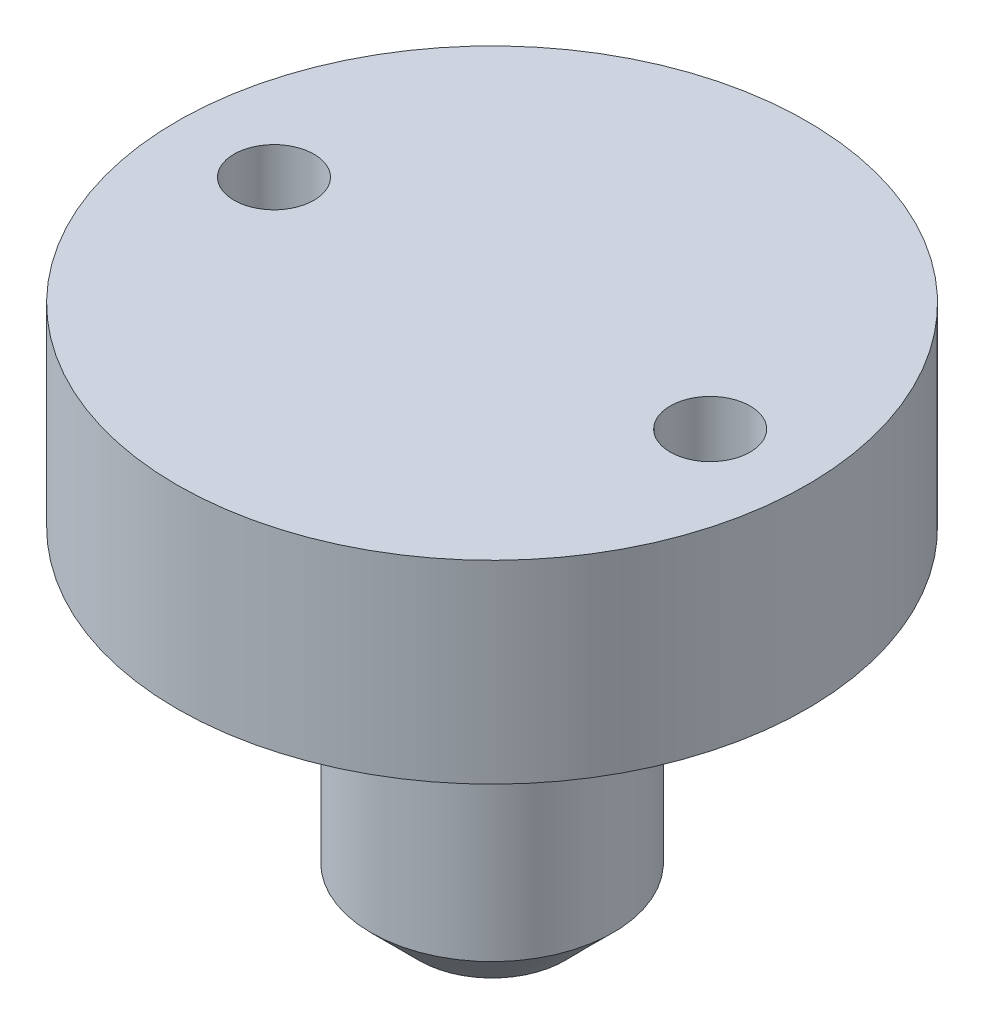
ISO-10303-21;
HEADER;
FILE_DESCRIPTION(('STEP AP214'),'2;1');
FILE_NAME('part.step','',(''),(''),'','','');
FILE_SCHEMA(('AUTOMOTIVE_DESIGN { 1 0 10303 214 1 1 1 1 }'));
ENDSEC;
DATA;
#1=APPLICATION_CONTEXT('core data for automotive mechanical design processes');
#2=APPLICATION_PROTOCOL_DEFINITION('international standard','automotive_design',2000,#1);
#3=PRODUCT_CONTEXT('',#1,'mechanical');
#4=PRODUCT('Part','Part','',(#3));
#5=PRODUCT_RELATED_PRODUCT_CATEGORY('part','',(#4));
#6=PRODUCT_DEFINITION_FORMATION('','',#4);
#7=PRODUCT_DEFINITION_CONTEXT('part definition',#1,'design');
#8=PRODUCT_DEFINITION('design','',#6,#7);
#9=PRODUCT_DEFINITION_SHAPE('','',#8);
#10=(LENGTH_UNIT() NAMED_UNIT(*) SI_UNIT(.MILLI.,.METRE.));
#11=(NAMED_UNIT(*) PLANE_ANGLE_UNIT() SI_UNIT($,.RADIAN.));
#12=(NAMED_UNIT(*) SI_UNIT($,.STERADIAN.) SOLID_ANGLE_UNIT());
#13=UNCERTAINTY_MEASURE_WITH_UNIT(LENGTH_MEASURE(1.E-05),#10,'distance_accuracy_value','');
#14=(GEOMETRIC_REPRESENTATION_CONTEXT(3) GLOBAL_UNCERTAINTY_ASSIGNED_CONTEXT((#13)) GLOBAL_UNIT_ASSIGNED_CONTEXT((#10,
#11,#12)) REPRESENTATION_CONTEXT('',''));
#15=CARTESIAN_POINT('',(0.,0.,0.));
#16=DIRECTION('',(0.,0.,1.));
#17=DIRECTION('',(1.,0.,0.));
#18=AXIS2_PLACEMENT_3D('',#15,#16,#17);
#19=CARTESIAN_POINT('',(0.,0.,0.));
#20=DIRECTION('',(0.,1.,0.));
#21=DIRECTION('',(0.,0.,1.));
#22=AXIS2_PLACEMENT_3D('',#19,#20,#21);
#23=PLANE('',#22);
#24=CARTESIAN_POINT('',(0.,0.,0.));
#25=DIRECTION('',(0.,1.,0.));
#26=DIRECTION('',(0.,0.,1.));
#27=AXIS2_PLACEMENT_3D('',#24,#25,#26);
#28=CIRCLE('',#27,3.00000000000001);
#29=CARTESIAN_POINT('',(0.,0.,3.00000000000001));
#30=VERTEX_POINT('',#29);
#31=EDGE_CURVE('E11',#30,#30,#28,.F.);
#32=ORIENTED_EDGE('',*,*,#31,.T.);
#33=EDGE_LOOP('',(#32));
#34=FACE_BOUND('',#33,.T.);
#35=ADVANCED_FACE('F41',(#34),#23,.F.);
#36=CARTESIAN_POINT('',(0.,60.7909556313993,0.));
#37=DIRECTION('',(0.,1.,0.));
#38=DIRECTION('',(0.,0.,1.));
#39=AXIS2_PLACEMENT_3D('',#36,#37,#38);
#40=CYLINDRICAL_SURFACE('',#39,5.00000000000001);
#41=CARTESIAN_POINT('',(0.,1.99999999999999,0.));
#42=DIRECTION('',(0.,1.,0.));
#43=DIRECTION('',(0.,0.,1.));
#44=AXIS2_PLACEMENT_3D('',#41,#42,#43);
#45=CIRCLE('',#44,5.00000000000001);
#46=CARTESIAN_POINT('',(0.,1.99999999999999,5.00000000000001));
#47=VERTEX_POINT('',#46);
#48=EDGE_CURVE('E49',#47,#47,#45,.T.);
#49=ORIENTED_EDGE('',*,*,#48,.T.);
#50=EDGE_LOOP('',(#49));
#51=FACE_BOUND('',#50,.T.);
#52=CARTESIAN_POINT('',(0.,12.,0.));
#53=DIRECTION('',(0.,1.,0.));
#54=DIRECTION('',(0.,0.,1.));
#55=AXIS2_PLACEMENT_3D('',#52,#53,#54);
#56=CIRCLE('',#55,5.00000000000001);
#57=CARTESIAN_POINT('',(0.,12.,5.00000000000001));
#58=VERTEX_POINT('',#57);
#59=EDGE_CURVE('E88',#58,#58,#56,.T.);
#60=ORIENTED_EDGE('',*,*,#59,.F.);
#61=EDGE_LOOP('',(#60));
#62=FACE_BOUND('',#61,.T.);
#63=ADVANCED_FACE('F93',(#51,#62),#40,.T.);
#64=CARTESIAN_POINT('',(5.00000000000001,12.,0.));
#65=DIRECTION('',(0.,-1.,0.));
#66=DIRECTION('',(0.,0.,-1.));
#67=AXIS2_PLACEMENT_3D('',#64,#65,#66);
#68=PLANE('',#67);
#69=CARTESIAN_POINT('',(0.,12.,0.));
#70=DIRECTION('',(0.,1.,0.));
#71=DIRECTION('',(0.,0.,1.));
#72=AXIS2_PLACEMENT_3D('',#69,#70,#71);
#73=CIRCLE('',#72,4.00000000000001);
#74=CARTESIAN_POINT('',(0.,12.,4.00000000000001));
#75=VERTEX_POINT('',#74);
#76=EDGE_CURVE('E85',#75,#75,#73,.T.);
#77=ORIENTED_EDGE('',*,*,#76,.F.);
#78=EDGE_LOOP('',(#77));
#79=FACE_BOUND('',#78,.T.);
#80=ORIENTED_EDGE('',*,*,#59,.T.);
#81=EDGE_LOOP('',(#80));
#82=FACE_BOUND('',#81,.T.);
#83=ADVANCED_FACE('F114',(#79,#82),#68,.F.);
#84=CARTESIAN_POINT('',(0.,60.7909556313993,0.));
#85=DIRECTION('',(0.,1.,0.));
#86=DIRECTION('',(0.,0.,1.));
#87=AXIS2_PLACEMENT_3D('',#84,#85,#86);
#88=CYLINDRICAL_SURFACE('',#87,4.00000000000001);
#89=CARTESIAN_POINT('',(0.,14.,0.));
#90=DIRECTION('',(0.,1.,0.));
#91=DIRECTION('',(0.,0.,1.));
#92=AXIS2_PLACEMENT_3D('',#89,#90,#91);
#93=CIRCLE('',#92,4.00000000000001);
#94=CARTESIAN_POINT('',(0.,14.,4.00000000000001));
#95=VERTEX_POINT('',#94);
#96=EDGE_CURVE('E82',#95,#95,#93,.T.);
#97=ORIENTED_EDGE('',*,*,#96,.F.);
#98=EDGE_LOOP('',(#97));
#99=FACE_BOUND('',#98,.T.);
#100=ORIENTED_EDGE('',*,*,#76,.T.);
#101=EDGE_LOOP('',(#100));
#102=FACE_BOUND('',#101,.T.);
#103=ADVANCED_FACE('F119',(#99,#102),#88,.T.);
#104=CARTESIAN_POINT('',(4.00000000000001,14.,0.));
#105=DIRECTION('',(0.,1.,0.));
#106=DIRECTION('',(0.,0.,1.));
#107=AXIS2_PLACEMENT_3D('',#104,#105,#106);
#108=PLANE('',#107);
#109=CARTESIAN_POINT('',(0.,14.,0.));
#110=DIRECTION('',(0.,1.,0.));
#111=DIRECTION('',(0.,0.,1.));
#112=AXIS2_PLACEMENT_3D('',#109,#110,#111);
#113=CIRCLE('',#112,13.);
#114=CARTESIAN_POINT('',(0.,14.,13.));
#115=VERTEX_POINT('',#114);
#116=EDGE_CURVE('E79',#115,#115,#113,.T.);
#117=ORIENTED_EDGE('',*,*,#116,.F.);
#118=EDGE_LOOP('',(#117));
#119=FACE_BOUND('',#118,.T.);
#120=ORIENTED_EDGE('',*,*,#96,.T.);
#121=EDGE_LOOP('',(#120));
#122=FACE_BOUND('',#121,.T.);
#123=ADVANCED_FACE('F123',(#119,#122),#108,.F.);
#124=CARTESIAN_POINT('',(0.,60.7909556313993,0.));
#125=DIRECTION('',(0.,1.,0.));
#126=DIRECTION('',(0.,0.,1.));
#127=AXIS2_PLACEMENT_3D('',#124,#125,#126);
#128=CYLINDRICAL_SURFACE('',#127,13.);
#129=CARTESIAN_POINT('',(0.,22.,0.));
#130=DIRECTION('',(0.,1.,0.));
#131=DIRECTION('',(0.,0.,1.));
#132=AXIS2_PLACEMENT_3D('',#129,#130,#131);
#133=CIRCLE('',#132,13.);
#134=CARTESIAN_POINT('',(0.,22.,13.));
#135=VERTEX_POINT('',#134);
#136=EDGE_CURVE('E76',#135,#135,#133,.T.);
#137=ORIENTED_EDGE('',*,*,#136,.F.);
#138=EDGE_LOOP('',(#137));
#139=FACE_BOUND('',#138,.T.);
#140=ORIENTED_EDGE('',*,*,#116,.T.);
#141=EDGE_LOOP('',(#140));
#142=FACE_BOUND('',#141,.T.);
#143=ADVANCED_FACE('F105',(#139,#142),#128,.T.);
#144=CARTESIAN_POINT('',(13.,22.,0.));
#145=DIRECTION('',(0.,-1.,0.));
#146=DIRECTION('',(0.,0.,-1.));
#147=AXIS2_PLACEMENT_3D('',#144,#145,#146);
#148=PLANE('',#147);
#149=CARTESIAN_POINT('',(-9.,22.,0.));
#150=DIRECTION('',(0.,1.,0.));
#151=DIRECTION('',(0.,0.,1.));
#152=AXIS2_PLACEMENT_3D('',#149,#150,#151);
#153=CIRCLE('',#152,1.65);
#154=CARTESIAN_POINT('',(-9.,22.,1.65));
#155=VERTEX_POINT('',#154);
#156=EDGE_CURVE('E66',#155,#155,#153,.T.);
#157=ORIENTED_EDGE('',*,*,#156,.F.);
#158=EDGE_LOOP('',(#157));
#159=FACE_BOUND('',#158,.T.);
#160=CARTESIAN_POINT('',(9.,22.,0.));
#161=DIRECTION('',(0.,1.,0.));
#162=DIRECTION('',(0.,0.,1.));
#163=AXIS2_PLACEMENT_3D('',#160,#161,#162);
#164=CIRCLE('',#163,1.65);
#165=CARTESIAN_POINT('',(9.,22.,1.65));
#166=VERTEX_POINT('',#165);
#167=EDGE_CURVE('E65',#166,#166,#164,.T.);
#168=ORIENTED_EDGE('',*,*,#167,.F.);
#169=EDGE_LOOP('',(#168));
#170=FACE_BOUND('',#169,.T.);
#171=ORIENTED_EDGE('',*,*,#136,.T.);
#172=EDGE_LOOP('',(#171));
#173=FACE_BOUND('',#172,.T.);
#174=ADVANCED_FACE('F98',(#159,#170,#173),#148,.F.);
#175=CARTESIAN_POINT('',(0.,1.99999999999999,0.));
#176=DIRECTION('',(0.,1.,0.));
#177=DIRECTION('',(0.,0.,1.));
#178=AXIS2_PLACEMENT_3D('',#175,#176,#177);
#179=CONICAL_SURFACE('',#178,5.00000000000001,0.78539816339745);
#180=ORIENTED_EDGE('',*,*,#31,.F.);
#181=EDGE_LOOP('',(#180));
#182=FACE_BOUND('',#181,.T.);
#183=ORIENTED_EDGE('',*,*,#48,.F.);
#184=EDGE_LOOP('',(#183));
#185=FACE_BOUND('',#184,.T.);
#186=ADVANCED_FACE('F43',(#182,#185),#179,.T.);
#187=CARTESIAN_POINT('',(9.,18.,0.));
#188=DIRECTION('',(0.,1.,0.));
#189=DIRECTION('',(0.,0.,1.));
#190=AXIS2_PLACEMENT_3D('',#187,#188,#189);
#191=CONICAL_SURFACE('',#190,1.65,1.02974425867665);
#192=CARTESIAN_POINT('',(9.,17.0085799786045,0.));
#193=VERTEX_POINT('',#192);
#194=VERTEX_LOOP('',#193);
#195=FACE_BOUND('',#194,.T.);
#196=CARTESIAN_POINT('',(9.,18.,0.));
#197=DIRECTION('',(0.,1.,0.));
#198=DIRECTION('',(0.,0.,1.));
#199=AXIS2_PLACEMENT_3D('',#196,#197,#198);
#200=CIRCLE('',#199,1.65);
#201=CARTESIAN_POINT('',(9.,18.,1.65));
#202=VERTEX_POINT('',#201);
#203=EDGE_CURVE('E69',#202,#202,#200,.T.);
#204=ORIENTED_EDGE('',*,*,#203,.T.);
#205=EDGE_LOOP('',(#204));
#206=FACE_BOUND('',#205,.T.);
#207=ADVANCED_FACE('F97',(#195,#206),#191,.F.);
#208=CARTESIAN_POINT('',(9.,22.,0.));
#209=DIRECTION('',(0.,1.,0.));
#210=DIRECTION('',(0.,0.,1.));
#211=AXIS2_PLACEMENT_3D('',#208,#209,#210);
#212=CYLINDRICAL_SURFACE('',#211,1.65);
#213=ORIENTED_EDGE('',*,*,#203,.F.);
#214=EDGE_LOOP('',(#213));
#215=FACE_BOUND('',#214,.T.);
#216=ORIENTED_EDGE('',*,*,#167,.T.);
#217=EDGE_LOOP('',(#216));
#218=FACE_BOUND('',#217,.T.);
#219=ADVANCED_FACE('F59',(#215,#218),#212,.F.);
#220=CARTESIAN_POINT('',(-9.,18.,0.));
#221=DIRECTION('',(0.,1.,0.));
#222=DIRECTION('',(0.,0.,1.));
#223=AXIS2_PLACEMENT_3D('',#220,#221,#222);
#224=CONICAL_SURFACE('',#223,1.65,1.02974425867665);
#225=CARTESIAN_POINT('',(-9.,17.0085799786045,0.));
#226=VERTEX_POINT('',#225);
#227=VERTEX_LOOP('',#226);
#228=FACE_BOUND('',#227,.T.);
#229=CARTESIAN_POINT('',(-9.,18.,0.));
#230=DIRECTION('',(0.,1.,0.));
#231=DIRECTION('',(0.,0.,1.));
#232=AXIS2_PLACEMENT_3D('',#229,#230,#231);
#233=CIRCLE('',#232,1.65);
#234=CARTESIAN_POINT('',(-9.,18.,1.65));
#235=VERTEX_POINT('',#234);
#236=EDGE_CURVE('E63',#235,#235,#233,.T.);
#237=ORIENTED_EDGE('',*,*,#236,.T.);
#238=EDGE_LOOP('',(#237));
#239=FACE_BOUND('',#238,.T.);
#240=ADVANCED_FACE('F55',(#228,#239),#224,.F.);
#241=CARTESIAN_POINT('',(-9.,22.,0.));
#242=DIRECTION('',(0.,1.,0.));
#243=DIRECTION('',(0.,0.,1.));
#244=AXIS2_PLACEMENT_3D('',#241,#242,#243);
#245=CYLINDRICAL_SURFACE('',#244,1.65);
#246=ORIENTED_EDGE('',*,*,#236,.F.);
#247=EDGE_LOOP('',(#246));
#248=FACE_BOUND('',#247,.T.);
#249=ORIENTED_EDGE('',*,*,#156,.T.);
#250=EDGE_LOOP('',(#249));
#251=FACE_BOUND('',#250,.T.);
#252=ADVANCED_FACE('F58',(#248,#251),#245,.F.);
#253=CLOSED_SHELL('',(#35,#63,#83,#103,#123,#143,#174,#186,#207,#219,#240,#252));
#254=MANIFOLD_SOLID_BREP('B2',#253);
#255=ADVANCED_BREP_SHAPE_REPRESENTATION('',(#18,#254),#14);
#256=SHAPE_DEFINITION_REPRESENTATION(#9,#255);
ENDSEC;
END-ISO-10303-21;
